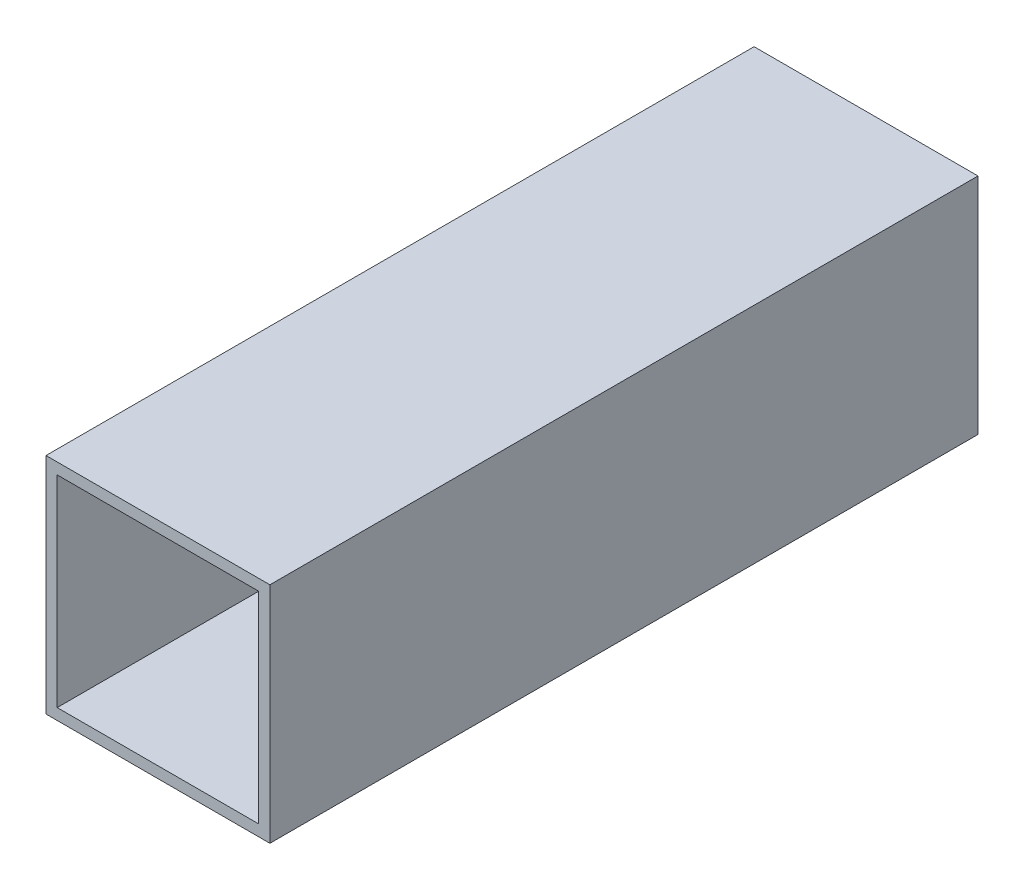
ISO-10303-21;
HEADER;
FILE_DESCRIPTION(('STEP AP214'),'2;1');
FILE_NAME('part.step','',(''),(''),'','','');
FILE_SCHEMA(('AUTOMOTIVE_DESIGN { 1 0 10303 214 1 1 1 1 }'));
ENDSEC;
DATA;
#1=APPLICATION_CONTEXT('core data for automotive mechanical design processes');
#2=APPLICATION_PROTOCOL_DEFINITION('international standard','automotive_design',2000,#1);
#3=PRODUCT_CONTEXT('',#1,'mechanical');
#4=PRODUCT('Part','Part','',(#3));
#5=PRODUCT_RELATED_PRODUCT_CATEGORY('part','',(#4));
#6=PRODUCT_DEFINITION_FORMATION('','',#4);
#7=PRODUCT_DEFINITION_CONTEXT('part definition',#1,'design');
#8=PRODUCT_DEFINITION('design','',#6,#7);
#9=PRODUCT_DEFINITION_SHAPE('','',#8);
#10=(LENGTH_UNIT() NAMED_UNIT(*) SI_UNIT(.MILLI.,.METRE.));
#11=(NAMED_UNIT(*) PLANE_ANGLE_UNIT() SI_UNIT($,.RADIAN.));
#12=(NAMED_UNIT(*) SI_UNIT($,.STERADIAN.) SOLID_ANGLE_UNIT());
#13=UNCERTAINTY_MEASURE_WITH_UNIT(LENGTH_MEASURE(1.E-05),#10,'distance_accuracy_value','');
#14=(GEOMETRIC_REPRESENTATION_CONTEXT(3) GLOBAL_UNCERTAINTY_ASSIGNED_CONTEXT((#13)) GLOBAL_UNIT_ASSIGNED_CONTEXT((#10,
#11,#12)) REPRESENTATION_CONTEXT('',''));
#15=CARTESIAN_POINT('',(0.,0.,0.));
#16=DIRECTION('',(0.,0.,1.));
#17=DIRECTION('',(1.,0.,0.));
#18=AXIS2_PLACEMENT_3D('',#15,#16,#17);
#19=CARTESIAN_POINT('',(-20.,-20.,126.5));
#20=DIRECTION('',(0.,0.,1.));
#21=DIRECTION('',(1.,0.,0.));
#22=AXIS2_PLACEMENT_3D('',#19,#20,#21);
#23=PLANE('',#22);
#24=DIRECTION('',(0.,-1.,0.));
#25=VECTOR('',#24,1.);
#26=CARTESIAN_POINT('',(-20.,-20.,126.5));
#27=LINE('',#26,#25);
#28=CARTESIAN_POINT('',(-20.,20.,126.5));
#29=VERTEX_POINT('',#28);
#30=CARTESIAN_POINT('',(-20.,-20.,126.5));
#31=VERTEX_POINT('',#30);
#32=EDGE_CURVE('E155',#29,#31,#27,.T.);
#33=ORIENTED_EDGE('',*,*,#32,.T.);
#34=DIRECTION('',(1.,0.,0.));
#35=VECTOR('',#34,1.);
#36=CARTESIAN_POINT('',(20.,-20.,126.5));
#37=LINE('',#36,#35);
#38=CARTESIAN_POINT('',(20.,-20.,126.5));
#39=VERTEX_POINT('',#38);
#40=EDGE_CURVE('E158',#31,#39,#37,.T.);
#41=ORIENTED_EDGE('',*,*,#40,.T.);
#42=DIRECTION('',(0.,1.,0.));
#43=VECTOR('',#42,1.);
#44=CARTESIAN_POINT('',(20.,-20.,126.5));
#45=LINE('',#44,#43);
#46=CARTESIAN_POINT('',(20.,20.,126.5));
#47=VERTEX_POINT('',#46);
#48=EDGE_CURVE('E161',#39,#47,#45,.T.);
#49=ORIENTED_EDGE('',*,*,#48,.T.);
#50=DIRECTION('',(-1.,0.,0.));
#51=VECTOR('',#50,1.);
#52=CARTESIAN_POINT('',(20.,20.,126.5));
#53=LINE('',#52,#51);
#54=EDGE_CURVE('E163',#47,#29,#53,.T.);
#55=ORIENTED_EDGE('',*,*,#54,.T.);
#56=EDGE_LOOP('',(#33,#41,#49,#55));
#57=FACE_BOUND('',#56,.T.);
#58=DIRECTION('',(1.,0.,0.));
#59=VECTOR('',#58,1.);
#60=CARTESIAN_POINT('',(20.,-18.,126.5));
#61=LINE('',#60,#59);
#62=CARTESIAN_POINT('',(-18.,-18.,126.5));
#63=VERTEX_POINT('',#62);
#64=CARTESIAN_POINT('',(18.,-18.,126.5));
#65=VERTEX_POINT('',#64);
#66=EDGE_CURVE('E127',#63,#65,#61,.T.);
#67=ORIENTED_EDGE('',*,*,#66,.F.);
#68=DIRECTION('',(0.,-1.,0.));
#69=VECTOR('',#68,1.);
#70=CARTESIAN_POINT('',(-18.,-20.,126.5));
#71=LINE('',#70,#69);
#72=CARTESIAN_POINT('',(-18.,18.,126.5));
#73=VERTEX_POINT('',#72);
#74=EDGE_CURVE('E119',#73,#63,#71,.T.);
#75=ORIENTED_EDGE('',*,*,#74,.F.);
#76=DIRECTION('',(-1.,0.,0.));
#77=VECTOR('',#76,1.);
#78=CARTESIAN_POINT('',(20.,18.,126.5));
#79=LINE('',#78,#77);
#80=CARTESIAN_POINT('',(18.,18.,126.5));
#81=VERTEX_POINT('',#80);
#82=EDGE_CURVE('E141',#81,#73,#79,.T.);
#83=ORIENTED_EDGE('',*,*,#82,.F.);
#84=DIRECTION('',(0.,1.,0.));
#85=VECTOR('',#84,1.);
#86=CARTESIAN_POINT('',(18.,-20.,126.5));
#87=LINE('',#86,#85);
#88=EDGE_CURVE('E139',#65,#81,#87,.T.);
#89=ORIENTED_EDGE('',*,*,#88,.F.);
#90=EDGE_LOOP('',(#67,#75,#83,#89));
#91=FACE_BOUND('',#90,.T.);
#92=ADVANCED_FACE('F54',(#57,#91),#23,.T.);
#93=CARTESIAN_POINT('',(-20.,-20.,0.));
#94=DIRECTION('',(0.,0.,1.));
#95=DIRECTION('',(1.,0.,0.));
#96=AXIS2_PLACEMENT_3D('',#93,#94,#95);
#97=PLANE('',#96);
#98=DIRECTION('',(0.,-1.,0.));
#99=VECTOR('',#98,1.);
#100=CARTESIAN_POINT('',(-20.,-20.,0.));
#101=LINE('',#100,#99);
#102=CARTESIAN_POINT('',(-20.,20.,0.));
#103=VERTEX_POINT('',#102);
#104=CARTESIAN_POINT('',(-20.,-20.,0.));
#105=VERTEX_POINT('',#104);
#106=EDGE_CURVE('E135',#103,#105,#101,.T.);
#107=ORIENTED_EDGE('',*,*,#106,.F.);
#108=DIRECTION('',(-1.,0.,0.));
#109=VECTOR('',#108,1.);
#110=CARTESIAN_POINT('',(20.,20.,0.));
#111=LINE('',#110,#109);
#112=CARTESIAN_POINT('',(20.,20.,0.));
#113=VERTEX_POINT('',#112);
#114=EDGE_CURVE('E159',#113,#103,#111,.T.);
#115=ORIENTED_EDGE('',*,*,#114,.F.);
#116=DIRECTION('',(0.,1.,0.));
#117=VECTOR('',#116,1.);
#118=CARTESIAN_POINT('',(20.,-20.,0.));
#119=LINE('',#118,#117);
#120=CARTESIAN_POINT('',(20.,-20.,0.));
#121=VERTEX_POINT('',#120);
#122=EDGE_CURVE('E170',#121,#113,#119,.T.);
#123=ORIENTED_EDGE('',*,*,#122,.F.);
#124=DIRECTION('',(1.,0.,0.));
#125=VECTOR('',#124,1.);
#126=CARTESIAN_POINT('',(20.,-20.,0.));
#127=LINE('',#126,#125);
#128=EDGE_CURVE('E168',#105,#121,#127,.T.);
#129=ORIENTED_EDGE('',*,*,#128,.F.);
#130=EDGE_LOOP('',(#107,#115,#123,#129));
#131=FACE_BOUND('',#130,.T.);
#132=DIRECTION('',(0.,-1.,0.));
#133=VECTOR('',#132,1.);
#134=CARTESIAN_POINT('',(-18.,-20.,0.));
#135=LINE('',#134,#133);
#136=CARTESIAN_POINT('',(-18.,18.,0.));
#137=VERTEX_POINT('',#136);
#138=CARTESIAN_POINT('',(-18.,-18.,0.));
#139=VERTEX_POINT('',#138);
#140=EDGE_CURVE('E77',#137,#139,#135,.T.);
#141=ORIENTED_EDGE('',*,*,#140,.T.);
#142=DIRECTION('',(1.,0.,0.));
#143=VECTOR('',#142,1.);
#144=CARTESIAN_POINT('',(20.,-18.,0.));
#145=LINE('',#144,#143);
#146=CARTESIAN_POINT('',(18.,-18.,0.));
#147=VERTEX_POINT('',#146);
#148=EDGE_CURVE('E134',#139,#147,#145,.T.);
#149=ORIENTED_EDGE('',*,*,#148,.T.);
#150=DIRECTION('',(0.,1.,0.));
#151=VECTOR('',#150,1.);
#152=CARTESIAN_POINT('',(18.,-20.,0.));
#153=LINE('',#152,#151);
#154=CARTESIAN_POINT('',(18.,18.,0.));
#155=VERTEX_POINT('',#154);
#156=EDGE_CURVE('E147',#147,#155,#153,.T.);
#157=ORIENTED_EDGE('',*,*,#156,.T.);
#158=DIRECTION('',(-1.,0.,0.));
#159=VECTOR('',#158,1.);
#160=CARTESIAN_POINT('',(20.,18.,0.));
#161=LINE('',#160,#159);
#162=EDGE_CURVE('E128',#155,#137,#161,.T.);
#163=ORIENTED_EDGE('',*,*,#162,.T.);
#164=EDGE_LOOP('',(#141,#149,#157,#163));
#165=FACE_BOUND('',#164,.T.);
#166=ADVANCED_FACE('F188',(#131,#165),#97,.F.);
#167=CARTESIAN_POINT('',(-20.,-20.,126.5));
#168=DIRECTION('',(1.,0.,0.));
#169=DIRECTION('',(0.,0.,-1.));
#170=AXIS2_PLACEMENT_3D('',#167,#168,#169);
#171=PLANE('',#170);
#172=ORIENTED_EDGE('',*,*,#106,.T.);
#173=DIRECTION('',(0.,0.,-1.));
#174=VECTOR('',#173,1.);
#175=CARTESIAN_POINT('',(-20.,-20.,126.5));
#176=LINE('',#175,#174);
#177=EDGE_CURVE('E12',#31,#105,#176,.T.);
#178=ORIENTED_EDGE('',*,*,#177,.F.);
#179=ORIENTED_EDGE('',*,*,#32,.F.);
#180=DIRECTION('',(0.,0.,-1.));
#181=VECTOR('',#180,1.);
#182=CARTESIAN_POINT('',(-20.,20.,126.5));
#183=LINE('',#182,#181);
#184=EDGE_CURVE('E165',#29,#103,#183,.T.);
#185=ORIENTED_EDGE('',*,*,#184,.T.);
#186=EDGE_LOOP('',(#172,#178,#179,#185));
#187=FACE_BOUND('',#186,.T.);
#188=ADVANCED_FACE('F56',(#187),#171,.F.);
#189=CARTESIAN_POINT('',(20.,-20.,126.5));
#190=DIRECTION('',(0.,1.,0.));
#191=DIRECTION('',(-1.,0.,0.));
#192=AXIS2_PLACEMENT_3D('',#189,#190,#191);
#193=PLANE('',#192);
#194=ORIENTED_EDGE('',*,*,#128,.T.);
#195=DIRECTION('',(0.,0.,-1.));
#196=VECTOR('',#195,1.);
#197=CARTESIAN_POINT('',(20.,-20.,126.5));
#198=LINE('',#197,#196);
#199=EDGE_CURVE('E62',#39,#121,#198,.T.);
#200=ORIENTED_EDGE('',*,*,#199,.F.);
#201=ORIENTED_EDGE('',*,*,#40,.F.);
#202=ORIENTED_EDGE('',*,*,#177,.T.);
#203=EDGE_LOOP('',(#194,#200,#201,#202));
#204=FACE_BOUND('',#203,.T.);
#205=ADVANCED_FACE('F198',(#204),#193,.F.);
#206=CARTESIAN_POINT('',(20.,-20.,126.5));
#207=DIRECTION('',(-1.,0.,0.));
#208=DIRECTION('',(0.,0.,1.));
#209=AXIS2_PLACEMENT_3D('',#206,#207,#208);
#210=PLANE('',#209);
#211=ORIENTED_EDGE('',*,*,#122,.T.);
#212=DIRECTION('',(0.,0.,-1.));
#213=VECTOR('',#212,1.);
#214=CARTESIAN_POINT('',(20.,20.,126.5));
#215=LINE('',#214,#213);
#216=EDGE_CURVE('E175',#47,#113,#215,.T.);
#217=ORIENTED_EDGE('',*,*,#216,.F.);
#218=ORIENTED_EDGE('',*,*,#48,.F.);
#219=ORIENTED_EDGE('',*,*,#199,.T.);
#220=EDGE_LOOP('',(#211,#217,#218,#219));
#221=FACE_BOUND('',#220,.T.);
#222=ADVANCED_FACE('F182',(#221),#210,.F.);
#223=CARTESIAN_POINT('',(20.,20.,126.5));
#224=DIRECTION('',(0.,-1.,0.));
#225=DIRECTION('',(1.,0.,0.));
#226=AXIS2_PLACEMENT_3D('',#223,#224,#225);
#227=PLANE('',#226);
#228=ORIENTED_EDGE('',*,*,#114,.T.);
#229=ORIENTED_EDGE('',*,*,#184,.F.);
#230=ORIENTED_EDGE('',*,*,#54,.F.);
#231=ORIENTED_EDGE('',*,*,#216,.T.);
#232=EDGE_LOOP('',(#228,#229,#230,#231));
#233=FACE_BOUND('',#232,.T.);
#234=ADVANCED_FACE('F192',(#233),#227,.F.);
#235=CARTESIAN_POINT('',(-18.,-20.,126.5));
#236=DIRECTION('',(1.,0.,0.));
#237=DIRECTION('',(0.,0.,-1.));
#238=AXIS2_PLACEMENT_3D('',#235,#236,#237);
#239=PLANE('',#238);
#240=ORIENTED_EDGE('',*,*,#140,.F.);
#241=DIRECTION('',(0.,0.,-1.));
#242=VECTOR('',#241,1.);
#243=CARTESIAN_POINT('',(-18.,18.,126.5));
#244=LINE('',#243,#242);
#245=EDGE_CURVE('E123',#73,#137,#244,.T.);
#246=ORIENTED_EDGE('',*,*,#245,.F.);
#247=ORIENTED_EDGE('',*,*,#74,.T.);
#248=DIRECTION('',(0.,0.,-1.));
#249=VECTOR('',#248,1.);
#250=CARTESIAN_POINT('',(-18.,-18.,126.5));
#251=LINE('',#250,#249);
#252=EDGE_CURVE('E122',#63,#139,#251,.T.);
#253=ORIENTED_EDGE('',*,*,#252,.T.);
#254=EDGE_LOOP('',(#240,#246,#247,#253));
#255=FACE_BOUND('',#254,.T.);
#256=ADVANCED_FACE('F121',(#255),#239,.T.);
#257=CARTESIAN_POINT('',(20.,-18.,126.5));
#258=DIRECTION('',(0.,1.,0.));
#259=DIRECTION('',(-1.,0.,0.));
#260=AXIS2_PLACEMENT_3D('',#257,#258,#259);
#261=PLANE('',#260);
#262=ORIENTED_EDGE('',*,*,#148,.F.);
#263=ORIENTED_EDGE('',*,*,#252,.F.);
#264=ORIENTED_EDGE('',*,*,#66,.T.);
#265=DIRECTION('',(0.,0.,-1.));
#266=VECTOR('',#265,1.);
#267=CARTESIAN_POINT('',(18.,-18.,126.5));
#268=LINE('',#267,#266);
#269=EDGE_CURVE('E136',#65,#147,#268,.T.);
#270=ORIENTED_EDGE('',*,*,#269,.T.);
#271=EDGE_LOOP('',(#262,#263,#264,#270));
#272=FACE_BOUND('',#271,.T.);
#273=ADVANCED_FACE('F131',(#272),#261,.T.);
#274=CARTESIAN_POINT('',(18.,-20.,126.5));
#275=DIRECTION('',(-1.,0.,0.));
#276=DIRECTION('',(0.,0.,1.));
#277=AXIS2_PLACEMENT_3D('',#274,#275,#276);
#278=PLANE('',#277);
#279=ORIENTED_EDGE('',*,*,#156,.F.);
#280=ORIENTED_EDGE('',*,*,#269,.F.);
#281=ORIENTED_EDGE('',*,*,#88,.T.);
#282=DIRECTION('',(0.,0.,-1.));
#283=VECTOR('',#282,1.);
#284=CARTESIAN_POINT('',(18.,18.,126.5));
#285=LINE('',#284,#283);
#286=EDGE_CURVE('E69',#81,#155,#285,.T.);
#287=ORIENTED_EDGE('',*,*,#286,.T.);
#288=EDGE_LOOP('',(#279,#280,#281,#287));
#289=FACE_BOUND('',#288,.T.);
#290=ADVANCED_FACE('F221',(#289),#278,.T.);
#291=CARTESIAN_POINT('',(20.,18.,126.5));
#292=DIRECTION('',(0.,-1.,0.));
#293=DIRECTION('',(1.,0.,0.));
#294=AXIS2_PLACEMENT_3D('',#291,#292,#293);
#295=PLANE('',#294);
#296=ORIENTED_EDGE('',*,*,#162,.F.);
#297=ORIENTED_EDGE('',*,*,#286,.F.);
#298=ORIENTED_EDGE('',*,*,#82,.T.);
#299=ORIENTED_EDGE('',*,*,#245,.T.);
#300=EDGE_LOOP('',(#296,#297,#298,#299));
#301=FACE_BOUND('',#300,.T.);
#302=ADVANCED_FACE('F225',(#301),#295,.T.);
#303=CLOSED_SHELL('',(#92,#166,#188,#205,#222,#234,#256,#273,#290,#302));
#304=MANIFOLD_SOLID_BREP('B2',#303);
#305=ADVANCED_BREP_SHAPE_REPRESENTATION('',(#18,#304),#14);
#306=SHAPE_DEFINITION_REPRESENTATION(#9,#305);
ENDSEC;
END-ISO-10303-21;
